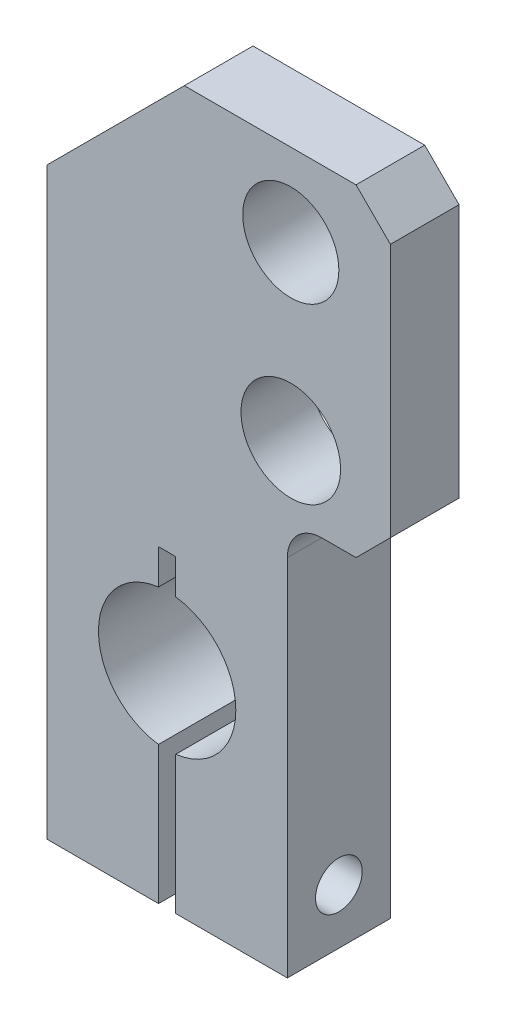
ISO-10303-21;
HEADER;
FILE_DESCRIPTION(('STEP AP214'),'2;1');
FILE_NAME('part.step','',(''),(''),'','','');
FILE_SCHEMA(('AUTOMOTIVE_DESIGN { 1 0 10303 214 1 1 1 1 }'));
ENDSEC;
DATA;
#1=APPLICATION_CONTEXT('core data for automotive mechanical design processes');
#2=APPLICATION_PROTOCOL_DEFINITION('international standard','automotive_design',2000,#1);
#3=PRODUCT_CONTEXT('',#1,'mechanical');
#4=PRODUCT('Part','Part','',(#3));
#5=PRODUCT_RELATED_PRODUCT_CATEGORY('part','',(#4));
#6=PRODUCT_DEFINITION_FORMATION('','',#4);
#7=PRODUCT_DEFINITION_CONTEXT('part definition',#1,'design');
#8=PRODUCT_DEFINITION('design','',#6,#7);
#9=PRODUCT_DEFINITION_SHAPE('','',#8);
#10=(LENGTH_UNIT() NAMED_UNIT(*) SI_UNIT(.MILLI.,.METRE.));
#11=(NAMED_UNIT(*) PLANE_ANGLE_UNIT() SI_UNIT($,.RADIAN.));
#12=(NAMED_UNIT(*) SI_UNIT($,.STERADIAN.) SOLID_ANGLE_UNIT());
#13=UNCERTAINTY_MEASURE_WITH_UNIT(LENGTH_MEASURE(1.E-05),#10,'distance_accuracy_value','');
#14=(GEOMETRIC_REPRESENTATION_CONTEXT(3) GLOBAL_UNCERTAINTY_ASSIGNED_CONTEXT((#13)) GLOBAL_UNIT_ASSIGNED_CONTEXT((#10,
#11,#12)) REPRESENTATION_CONTEXT('',''));
#15=CARTESIAN_POINT('',(0.,0.,0.));
#16=DIRECTION('',(0.,0.,1.));
#17=DIRECTION('',(1.,0.,0.));
#18=AXIS2_PLACEMENT_3D('',#15,#16,#17);
#19=CARTESIAN_POINT('',(-17.5,105.,7.5));
#20=DIRECTION('',(0.,-1.,0.));
#21=DIRECTION('',(0.,0.,-1.));
#22=AXIS2_PLACEMENT_3D('',#19,#20,#21);
#23=PLANE('',#22);
#24=DIRECTION('',(1.,0.,0.));
#25=VECTOR('',#24,1.);
#26=CARTESIAN_POINT('',(32.5,105.,-2.5));
#27=LINE('',#26,#25);
#28=CARTESIAN_POINT('',(2.50000000000008,105.,-2.5));
#29=VERTEX_POINT('',#28);
#30=CARTESIAN_POINT('',(27.5,105.,-2.5));
#31=VERTEX_POINT('',#30);
#32=EDGE_CURVE('E215',#29,#31,#27,.T.);
#33=ORIENTED_EDGE('',*,*,#32,.F.);
#34=DIRECTION('',(0.,0.,1.));
#35=VECTOR('',#34,1.);
#36=CARTESIAN_POINT('',(2.50000000000008,105.,7.5));
#37=LINE('',#36,#35);
#38=CARTESIAN_POINT('',(2.50000000000008,105.,7.5));
#39=VERTEX_POINT('',#38);
#40=EDGE_CURVE('E70',#29,#39,#37,.T.);
#41=ORIENTED_EDGE('',*,*,#40,.T.);
#42=DIRECTION('',(-1.,0.,0.));
#43=VECTOR('',#42,1.);
#44=CARTESIAN_POINT('',(-17.5,105.,7.5));
#45=LINE('',#44,#43);
#46=CARTESIAN_POINT('',(27.5,105.,7.5));
#47=VERTEX_POINT('',#46);
#48=EDGE_CURVE('E283',#47,#39,#45,.T.);
#49=ORIENTED_EDGE('',*,*,#48,.F.);
#50=DIRECTION('',(0.,0.,-1.));
#51=VECTOR('',#50,1.);
#52=CARTESIAN_POINT('',(27.5,105.,7.5));
#53=LINE('',#52,#51);
#54=EDGE_CURVE('E357',#47,#31,#53,.T.);
#55=ORIENTED_EDGE('',*,*,#54,.T.);
#56=EDGE_LOOP('',(#33,#41,#49,#55));
#57=FACE_BOUND('',#56,.T.);
#58=ADVANCED_FACE('F62',(#57),#23,.F.);
#59=CARTESIAN_POINT('',(32.5,58.,7.5));
#60=DIRECTION('',(0.,1.,0.));
#61=DIRECTION('',(0.,0.,1.));
#62=AXIS2_PLACEMENT_3D('',#59,#60,#61);
#63=PLANE('',#62);
#64=DIRECTION('',(-1.,0.,0.));
#65=VECTOR('',#64,1.);
#66=CARTESIAN_POINT('',(32.5,58.,-2.5));
#67=LINE('',#66,#65);
#68=CARTESIAN_POINT('',(27.5,58.,-2.5));
#69=VERTEX_POINT('',#68);
#70=CARTESIAN_POINT('',(22.5,58.,-2.5));
#71=VERTEX_POINT('',#70);
#72=EDGE_CURVE('E230',#69,#71,#67,.T.);
#73=ORIENTED_EDGE('',*,*,#72,.F.);
#74=DIRECTION('',(0.,0.,1.));
#75=VECTOR('',#74,1.);
#76=CARTESIAN_POINT('',(27.5,58.,7.5));
#77=LINE('',#76,#75);
#78=CARTESIAN_POINT('',(27.5,58.,7.5));
#79=VERTEX_POINT('',#78);
#80=EDGE_CURVE('E351',#69,#79,#77,.T.);
#81=ORIENTED_EDGE('',*,*,#80,.T.);
#82=DIRECTION('',(1.,0.,0.));
#83=VECTOR('',#82,1.);
#84=CARTESIAN_POINT('',(32.5,58.,7.5));
#85=LINE('',#84,#83);
#86=CARTESIAN_POINT('',(22.5,58.,7.5));
#87=VERTEX_POINT('',#86);
#88=EDGE_CURVE('E295',#87,#79,#85,.T.);
#89=ORIENTED_EDGE('',*,*,#88,.F.);
#90=DIRECTION('',(0.,0.,-1.));
#91=VECTOR('',#90,1.);
#92=CARTESIAN_POINT('',(22.5,58.,-7.5));
#93=LINE('',#92,#91);
#94=EDGE_CURVE('E327',#87,#71,#93,.T.);
#95=ORIENTED_EDGE('',*,*,#94,.T.);
#96=EDGE_LOOP('',(#73,#81,#89,#95));
#97=FACE_BOUND('',#96,.T.);
#98=ADVANCED_FACE('F405',(#97),#63,.F.);
#99=CARTESIAN_POINT('',(32.5,105.,7.5));
#100=DIRECTION('',(-1.,0.,0.));
#101=DIRECTION('',(0.,-1.,0.));
#102=AXIS2_PLACEMENT_3D('',#99,#100,#101);
#103=PLANE('',#102);
#104=DIRECTION('',(0.,1.,0.));
#105=VECTOR('',#104,1.);
#106=CARTESIAN_POINT('',(32.5,105.,7.5));
#107=LINE('',#106,#105);
#108=CARTESIAN_POINT('',(32.5,63.,7.5));
#109=VERTEX_POINT('',#108);
#110=CARTESIAN_POINT('',(32.5,100.,7.5));
#111=VERTEX_POINT('',#110);
#112=EDGE_CURVE('E298',#109,#111,#107,.T.);
#113=ORIENTED_EDGE('',*,*,#112,.F.);
#114=DIRECTION('',(0.,0.,-1.));
#115=VECTOR('',#114,1.);
#116=CARTESIAN_POINT('',(32.5,63.,7.5));
#117=LINE('',#116,#115);
#118=CARTESIAN_POINT('',(32.5,62.9999999999999,-2.5));
#119=VERTEX_POINT('',#118);
#120=EDGE_CURVE('E344',#109,#119,#117,.T.);
#121=ORIENTED_EDGE('',*,*,#120,.T.);
#122=DIRECTION('',(0.,-1.,0.));
#123=VECTOR('',#122,1.);
#124=CARTESIAN_POINT('',(32.5,105.,-2.5));
#125=LINE('',#124,#123);
#126=CARTESIAN_POINT('',(32.5,100.,-2.5));
#127=VERTEX_POINT('',#126);
#128=EDGE_CURVE('E205',#127,#119,#125,.T.);
#129=ORIENTED_EDGE('',*,*,#128,.F.);
#130=DIRECTION('',(0.,0.,1.));
#131=VECTOR('',#130,1.);
#132=CARTESIAN_POINT('',(32.5,100.,7.5));
#133=LINE('',#132,#131);
#134=EDGE_CURVE('E342',#127,#111,#133,.T.);
#135=ORIENTED_EDGE('',*,*,#134,.T.);
#136=EDGE_LOOP('',(#113,#121,#129,#135));
#137=FACE_BOUND('',#136,.T.);
#138=ADVANCED_FACE('F371',(#137),#103,.F.);
#139=CARTESIAN_POINT('',(18.,93.,-7.5));
#140=DIRECTION('',(0.,0.,1.));
#141=DIRECTION('',(1.,0.,0.));
#142=AXIS2_PLACEMENT_3D('',#139,#140,#141);
#143=CYLINDRICAL_SURFACE('',#142,7.);
#144=CARTESIAN_POINT('',(18.,93.,7.5));
#145=DIRECTION('',(0.,0.,1.));
#146=DIRECTION('',(1.,0.,0.));
#147=AXIS2_PLACEMENT_3D('',#144,#145,#146);
#148=CIRCLE('',#147,7.);
#149=CARTESIAN_POINT('',(25.,93.,7.5));
#150=VERTEX_POINT('',#149);
#151=EDGE_CURVE('E232',#150,#150,#148,.T.);
#152=ORIENTED_EDGE('',*,*,#151,.T.);
#153=EDGE_LOOP('',(#152));
#154=FACE_BOUND('',#153,.T.);
#155=CARTESIAN_POINT('',(18.,93.,-2.5));
#156=DIRECTION('',(0.,0.,-1.));
#157=DIRECTION('',(-1.,0.,0.));
#158=AXIS2_PLACEMENT_3D('',#155,#156,#157);
#159=CIRCLE('',#158,7.);
#160=CARTESIAN_POINT('',(11.,93.,-2.5));
#161=VERTEX_POINT('',#160);
#162=EDGE_CURVE('E214',#161,#161,#159,.F.);
#163=ORIENTED_EDGE('',*,*,#162,.F.);
#164=EDGE_LOOP('',(#163));
#165=FACE_BOUND('',#164,.T.);
#166=ADVANCED_FACE('F395',(#154,#165),#143,.F.);
#167=CARTESIAN_POINT('',(-17.5,105.,7.5));
#168=DIRECTION('',(1.,0.,0.));
#169=DIRECTION('',(0.,1.,0.));
#170=AXIS2_PLACEMENT_3D('',#167,#168,#169);
#171=PLANE('',#170);
#172=DIRECTION('',(0.,-1.,0.));
#173=VECTOR('',#172,1.);
#174=CARTESIAN_POINT('',(-17.5,105.,7.5));
#175=LINE('',#174,#173);
#176=CARTESIAN_POINT('',(-17.5,85.,7.5));
#177=VERTEX_POINT('',#176);
#178=CARTESIAN_POINT('',(-17.5,0.,7.5));
#179=VERTEX_POINT('',#178);
#180=EDGE_CURVE('E285',#177,#179,#175,.T.);
#181=ORIENTED_EDGE('',*,*,#180,.F.);
#182=DIRECTION('',(0.,0.,-1.));
#183=VECTOR('',#182,1.);
#184=CARTESIAN_POINT('',(-17.5,85.,7.5));
#185=LINE('',#184,#183);
#186=CARTESIAN_POINT('',(-17.5,85.,-2.5));
#187=VERTEX_POINT('',#186);
#188=EDGE_CURVE('E222',#177,#187,#185,.T.);
#189=ORIENTED_EDGE('',*,*,#188,.T.);
#190=DIRECTION('',(0.,1.,0.));
#191=VECTOR('',#190,1.);
#192=CARTESIAN_POINT('',(-17.5,105.,-2.5));
#193=LINE('',#192,#191);
#194=CARTESIAN_POINT('',(-17.5,55.,-2.5));
#195=VERTEX_POINT('',#194);
#196=EDGE_CURVE('E200',#195,#187,#193,.T.);
#197=ORIENTED_EDGE('',*,*,#196,.F.);
#198=DIRECTION('',(0.,0.,-1.));
#199=VECTOR('',#198,1.);
#200=CARTESIAN_POINT('',(-17.5,55.,-2.5));
#201=LINE('',#200,#199);
#202=CARTESIAN_POINT('',(-17.5,55.,-7.5));
#203=VERTEX_POINT('',#202);
#204=EDGE_CURVE('E208',#195,#203,#201,.T.);
#205=ORIENTED_EDGE('',*,*,#204,.T.);
#206=DIRECTION('',(0.,-1.,0.));
#207=VECTOR('',#206,1.);
#208=CARTESIAN_POINT('',(-17.5,105.,-7.5));
#209=LINE('',#208,#207);
#210=CARTESIAN_POINT('',(-17.5,0.,-7.5));
#211=VERTEX_POINT('',#210);
#212=EDGE_CURVE('E302',#203,#211,#209,.T.);
#213=ORIENTED_EDGE('',*,*,#212,.T.);
#214=DIRECTION('',(0.,0.,-1.));
#215=VECTOR('',#214,1.);
#216=CARTESIAN_POINT('',(-17.5,0.,7.5));
#217=LINE('',#216,#215);
#218=EDGE_CURVE('E312',#179,#211,#217,.T.);
#219=ORIENTED_EDGE('',*,*,#218,.F.);
#220=EDGE_LOOP('',(#181,#189,#197,#205,#213,#219));
#221=FACE_BOUND('',#220,.T.);
#222=CARTESIAN_POINT('',(-17.5,8.,0.));
#223=DIRECTION('',(1.,0.,0.));
#224=DIRECTION('',(0.,1.,0.));
#225=AXIS2_PLACEMENT_3D('',#222,#223,#224);
#226=CIRCLE('',#225,4.25);
#227=CARTESIAN_POINT('',(-17.5,12.25,0.));
#228=VERTEX_POINT('',#227);
#229=EDGE_CURVE('E239',#228,#228,#226,.T.);
#230=ORIENTED_EDGE('',*,*,#229,.T.);
#231=EDGE_LOOP('',(#230));
#232=FACE_BOUND('',#231,.T.);
#233=ADVANCED_FACE('F219',(#221,#232),#171,.F.);
#234=CARTESIAN_POINT('',(-1.25000000000001,45.,-7.5));
#235=DIRECTION('',(-1.,0.,0.));
#236=DIRECTION('',(0.,-1.,0.));
#237=AXIS2_PLACEMENT_3D('',#234,#235,#236);
#238=PLANE('',#237);
#239=DIRECTION('',(0.,-1.,0.));
#240=VECTOR('',#239,1.);
#241=CARTESIAN_POINT('',(-1.25000000000001,45.,7.5));
#242=LINE('',#241,#240);
#243=CARTESIAN_POINT('',(-1.25,20.0784325835078,7.5));
#244=VERTEX_POINT('',#243);
#245=CARTESIAN_POINT('',(-1.25,0.,7.5));
#246=VERTEX_POINT('',#245);
#247=EDGE_CURVE('E245',#244,#246,#242,.T.);
#248=ORIENTED_EDGE('',*,*,#247,.T.);
#249=DIRECTION('',(0.,0.,1.));
#250=VECTOR('',#249,1.);
#251=CARTESIAN_POINT('',(-1.25,0.,-7.5));
#252=LINE('',#251,#250);
#253=CARTESIAN_POINT('',(-1.25,0.,-7.5));
#254=VERTEX_POINT('',#253);
#255=EDGE_CURVE('E257',#254,#246,#252,.T.);
#256=ORIENTED_EDGE('',*,*,#255,.F.);
#257=DIRECTION('',(0.,-1.,0.));
#258=VECTOR('',#257,1.);
#259=CARTESIAN_POINT('',(-1.25000000000001,45.,-7.5));
#260=LINE('',#259,#258);
#261=CARTESIAN_POINT('',(-1.25,20.0784325835078,-7.5));
#262=VERTEX_POINT('',#261);
#263=EDGE_CURVE('E250',#262,#254,#260,.T.);
#264=ORIENTED_EDGE('',*,*,#263,.F.);
#265=DIRECTION('',(0.,0.,1.));
#266=VECTOR('',#265,1.);
#267=CARTESIAN_POINT('',(-1.25,20.0784325835078,-7.5));
#268=LINE('',#267,#266);
#269=EDGE_CURVE('E324',#244,#262,#268,.F.);
#270=ORIENTED_EDGE('',*,*,#269,.F.);
#271=EDGE_LOOP('',(#248,#256,#264,#270));
#272=FACE_BOUND('',#271,.T.);
#273=CARTESIAN_POINT('',(-1.25,8.,0.));
#274=DIRECTION('',(-1.,0.,0.));
#275=DIRECTION('',(0.,-1.,0.));
#276=AXIS2_PLACEMENT_3D('',#273,#274,#275);
#277=CIRCLE('',#276,4.25);
#278=CARTESIAN_POINT('',(-1.25,3.75,0.));
#279=VERTEX_POINT('',#278);
#280=EDGE_CURVE('E242',#279,#279,#277,.T.);
#281=ORIENTED_EDGE('',*,*,#280,.T.);
#282=EDGE_LOOP('',(#281));
#283=FACE_BOUND('',#282,.T.);
#284=ADVANCED_FACE('F403',(#272,#283),#238,.F.);
#285=CARTESIAN_POINT('',(-17.5,0.,7.5));
#286=DIRECTION('',(0.,1.,0.));
#287=DIRECTION('',(0.,0.,1.));
#288=AXIS2_PLACEMENT_3D('',#285,#286,#287);
#289=PLANE('',#288);
#290=DIRECTION('',(1.,0.,0.));
#291=VECTOR('',#290,1.);
#292=CARTESIAN_POINT('',(-17.5,0.,-7.5));
#293=LINE('',#292,#291);
#294=EDGE_CURVE('E305',#211,#254,#293,.T.);
#295=ORIENTED_EDGE('',*,*,#294,.T.);
#296=ORIENTED_EDGE('',*,*,#255,.T.);
#297=DIRECTION('',(1.,0.,0.));
#298=VECTOR('',#297,1.);
#299=CARTESIAN_POINT('',(-17.5,0.,7.5));
#300=LINE('',#299,#298);
#301=EDGE_CURVE('E289',#179,#246,#300,.T.);
#302=ORIENTED_EDGE('',*,*,#301,.F.);
#303=ORIENTED_EDGE('',*,*,#218,.T.);
#304=EDGE_LOOP('',(#295,#296,#302,#303));
#305=FACE_BOUND('',#304,.T.);
#306=ADVANCED_FACE('F439',(#305),#289,.F.);
#307=CARTESIAN_POINT('',(0.,30.,-7.5));
#308=DIRECTION('',(0.,0.,1.));
#309=DIRECTION('',(1.,0.,0.));
#310=AXIS2_PLACEMENT_3D('',#307,#308,#309);
#311=CYLINDRICAL_SURFACE('',#310,10.);
#312=CARTESIAN_POINT('',(0.,30.,7.5));
#313=DIRECTION('',(0.,0.,1.));
#314=DIRECTION('',(1.,0.,0.));
#315=AXIS2_PLACEMENT_3D('',#312,#313,#314);
#316=CIRCLE('',#315,10.);
#317=CARTESIAN_POINT('',(-1.25,39.9215674164922,7.5));
#318=VERTEX_POINT('',#317);
#319=EDGE_CURVE('E280',#318,#244,#316,.T.);
#320=ORIENTED_EDGE('',*,*,#319,.T.);
#321=ORIENTED_EDGE('',*,*,#269,.T.);
#322=CARTESIAN_POINT('',(0.,30.,-7.5));
#323=DIRECTION('',(0.,0.,1.));
#324=DIRECTION('',(1.,0.,0.));
#325=AXIS2_PLACEMENT_3D('',#322,#323,#324);
#326=CIRCLE('',#325,10.);
#327=CARTESIAN_POINT('',(-1.25,39.9215674164922,-7.5));
#328=VERTEX_POINT('',#327);
#329=EDGE_CURVE('E279',#328,#262,#326,.T.);
#330=ORIENTED_EDGE('',*,*,#329,.F.);
#331=DIRECTION('',(0.,0.,1.));
#332=VECTOR('',#331,1.);
#333=CARTESIAN_POINT('',(-1.25,39.9215674164922,-7.5));
#334=LINE('',#333,#332);
#335=EDGE_CURVE('E321',#328,#318,#334,.T.);
#336=ORIENTED_EDGE('',*,*,#335,.T.);
#337=EDGE_LOOP('',(#320,#321,#330,#336));
#338=FACE_BOUND('',#337,.T.);
#339=ADVANCED_FACE('F446',(#338),#311,.F.);
#340=CARTESIAN_POINT('',(1.25,0.,7.5));
#341=VERTEX_POINT('',#340);
#342=CARTESIAN_POINT('',(17.5,0.,7.5));
#343=VERTEX_POINT('',#342);
#344=EDGE_CURVE('E288',#341,#343,#300,.T.);
#345=ORIENTED_EDGE('',*,*,#344,.F.);
#346=DIRECTION('',(0.,0.,1.));
#347=VECTOR('',#346,1.);
#348=CARTESIAN_POINT('',(1.25,0.,-7.5));
#349=LINE('',#348,#347);
#350=CARTESIAN_POINT('',(1.25,0.,-7.5));
#351=VERTEX_POINT('',#350);
#352=EDGE_CURVE('E272',#351,#341,#349,.T.);
#353=ORIENTED_EDGE('',*,*,#352,.F.);
#354=CARTESIAN_POINT('',(17.5,0.,-7.5));
#355=VERTEX_POINT('',#354);
#356=EDGE_CURVE('E304',#351,#355,#293,.T.);
#357=ORIENTED_EDGE('',*,*,#356,.T.);
#358=DIRECTION('',(0.,0.,-1.));
#359=VECTOR('',#358,1.);
#360=CARTESIAN_POINT('',(17.5,0.,7.5));
#361=LINE('',#360,#359);
#362=EDGE_CURVE('E301',#343,#355,#361,.T.);
#363=ORIENTED_EDGE('',*,*,#362,.F.);
#364=EDGE_LOOP('',(#345,#353,#357,#363));
#365=FACE_BOUND('',#364,.T.);
#366=ADVANCED_FACE('F474',(#365),#289,.F.);
#367=CARTESIAN_POINT('',(17.5,58.,7.5));
#368=DIRECTION('',(-1.,0.,0.));
#369=DIRECTION('',(0.,-1.,0.));
#370=AXIS2_PLACEMENT_3D('',#367,#368,#369);
#371=PLANE('',#370);
#372=CARTESIAN_POINT('',(17.5,8.,0.));
#373=DIRECTION('',(1.,0.,0.));
#374=DIRECTION('',(0.,0.,-1.));
#375=AXIS2_PLACEMENT_3D('',#372,#373,#374);
#376=CIRCLE('',#375,3.39999999999999);
#377=CARTESIAN_POINT('',(17.5,8.,-3.39999999999999));
#378=VERTEX_POINT('',#377);
#379=EDGE_CURVE('E235',#378,#378,#376,.T.);
#380=ORIENTED_EDGE('',*,*,#379,.F.);
#381=EDGE_LOOP('',(#380));
#382=FACE_BOUND('',#381,.T.);
#383=DIRECTION('',(0.,1.,0.));
#384=VECTOR('',#383,1.);
#385=CARTESIAN_POINT('',(17.5,58.,-7.5));
#386=LINE('',#385,#384);
#387=CARTESIAN_POINT('',(17.5,53.,-7.5));
#388=VERTEX_POINT('',#387);
#389=EDGE_CURVE('E286',#355,#388,#386,.T.);
#390=ORIENTED_EDGE('',*,*,#389,.T.);
#391=DIRECTION('',(0.,0.,-1.));
#392=VECTOR('',#391,1.);
#393=CARTESIAN_POINT('',(17.5,53.,7.5));
#394=LINE('',#393,#392);
#395=CARTESIAN_POINT('',(17.5,53.,7.5));
#396=VERTEX_POINT('',#395);
#397=EDGE_CURVE('E330',#388,#396,#394,.F.);
#398=ORIENTED_EDGE('',*,*,#397,.T.);
#399=DIRECTION('',(0.,1.,0.));
#400=VECTOR('',#399,1.);
#401=CARTESIAN_POINT('',(17.5,58.,7.5));
#402=LINE('',#401,#400);
#403=EDGE_CURVE('E292',#343,#396,#402,.T.);
#404=ORIENTED_EDGE('',*,*,#403,.F.);
#405=ORIENTED_EDGE('',*,*,#362,.T.);
#406=EDGE_LOOP('',(#390,#398,#404,#405));
#407=FACE_BOUND('',#406,.T.);
#408=ADVANCED_FACE('F477',(#382,#407),#371,.F.);
#409=CARTESIAN_POINT('',(32.5,105.,7.5));
#410=DIRECTION('',(0.,0.,-1.));
#411=DIRECTION('',(-1.,0.,0.));
#412=AXIS2_PLACEMENT_3D('',#409,#410,#411);
#413=PLANE('',#412);
#414=CARTESIAN_POINT('',(18.,68.,7.5));
#415=DIRECTION('',(0.,0.,-1.));
#416=DIRECTION('',(-1.,0.,0.));
#417=AXIS2_PLACEMENT_3D('',#414,#415,#416);
#418=CIRCLE('',#417,7.25);
#419=CARTESIAN_POINT('',(10.75,68.,7.5));
#420=VERTEX_POINT('',#419);
#421=EDGE_CURVE('E227',#420,#420,#418,.T.);
#422=ORIENTED_EDGE('',*,*,#421,.T.);
#423=EDGE_LOOP('',(#422));
#424=FACE_BOUND('',#423,.T.);
#425=ORIENTED_EDGE('',*,*,#151,.F.);
#426=EDGE_LOOP('',(#425));
#427=FACE_BOUND('',#426,.T.);
#428=ORIENTED_EDGE('',*,*,#48,.T.);
#429=DIRECTION('',(0.707106781186549,0.707106781186546,0.));
#430=VECTOR('',#429,1.);
#431=CARTESIAN_POINT('',(-17.5,85.,7.5));
#432=LINE('',#431,#430);
#433=EDGE_CURVE('E12',#39,#177,#432,.F.);
#434=ORIENTED_EDGE('',*,*,#433,.T.);
#435=ORIENTED_EDGE('',*,*,#180,.T.);
#436=ORIENTED_EDGE('',*,*,#301,.T.);
#437=ORIENTED_EDGE('',*,*,#247,.F.);
#438=ORIENTED_EDGE('',*,*,#319,.F.);
#439=CARTESIAN_POINT('',(-1.25000000000001,45.,7.5));
#440=VERTEX_POINT('',#439);
#441=EDGE_CURVE('E258',#440,#318,#242,.T.);
#442=ORIENTED_EDGE('',*,*,#441,.F.);
#443=DIRECTION('',(-1.,0.,0.));
#444=VECTOR('',#443,1.);
#445=CARTESIAN_POINT('',(-1.25000000000001,45.,7.5));
#446=LINE('',#445,#444);
#447=CARTESIAN_POINT('',(1.25000000000001,45.,7.5));
#448=VERTEX_POINT('',#447);
#449=EDGE_CURVE('E263',#448,#440,#446,.T.);
#450=ORIENTED_EDGE('',*,*,#449,.F.);
#451=DIRECTION('',(0.,1.,0.));
#452=VECTOR('',#451,1.);
#453=CARTESIAN_POINT('',(1.25000000000001,45.,7.5));
#454=LINE('',#453,#452);
#455=CARTESIAN_POINT('',(1.25,39.9215674164922,7.5));
#456=VERTEX_POINT('',#455);
#457=EDGE_CURVE('E260',#456,#448,#454,.T.);
#458=ORIENTED_EDGE('',*,*,#457,.F.);
#459=CARTESIAN_POINT('',(1.25,20.0784325835078,7.5));
#460=VERTEX_POINT('',#459);
#461=EDGE_CURVE('E268',#460,#456,#316,.T.);
#462=ORIENTED_EDGE('',*,*,#461,.F.);
#463=EDGE_CURVE('E261',#341,#460,#454,.T.);
#464=ORIENTED_EDGE('',*,*,#463,.F.);
#465=ORIENTED_EDGE('',*,*,#344,.T.);
#466=ORIENTED_EDGE('',*,*,#403,.T.);
#467=CARTESIAN_POINT('',(22.5,53.,7.5));
#468=DIRECTION('',(0.,0.,-1.));
#469=DIRECTION('',(-1.,0.,0.));
#470=AXIS2_PLACEMENT_3D('',#467,#468,#469);
#471=CIRCLE('',#470,5.);
#472=EDGE_CURVE('E334',#396,#87,#471,.T.);
#473=ORIENTED_EDGE('',*,*,#472,.T.);
#474=ORIENTED_EDGE('',*,*,#88,.T.);
#475=DIRECTION('',(-0.70710678118655,-0.707106781186545,0.));
#476=VECTOR('',#475,1.);
#477=CARTESIAN_POINT('',(32.5,63.,7.5));
#478=LINE('',#477,#476);
#479=EDGE_CURVE('E355',#79,#109,#478,.F.);
#480=ORIENTED_EDGE('',*,*,#479,.T.);
#481=ORIENTED_EDGE('',*,*,#112,.T.);
#482=DIRECTION('',(0.707106781186547,-0.707106781186549,0.));
#483=VECTOR('',#482,1.);
#484=CARTESIAN_POINT('',(27.5,105.,7.5));
#485=LINE('',#484,#483);
#486=EDGE_CURVE('E353',#111,#47,#485,.F.);
#487=ORIENTED_EDGE('',*,*,#486,.T.);
#488=EDGE_LOOP('',(#428,#434,#435,#436,#437,#438,#442,#450,#458,#462,#464,#465,#466,#473,#474,
#480,#481,#487));
#489=FACE_BOUND('',#488,.T.);
#490=ADVANCED_FACE('F380',(#424,#427,#489),#413,.F.);
#491=CARTESIAN_POINT('',(32.5,105.,-7.5));
#492=DIRECTION('',(0.,0.,-1.));
#493=DIRECTION('',(-1.,0.,0.));
#494=AXIS2_PLACEMENT_3D('',#491,#492,#493);
#495=PLANE('',#494);
#496=DIRECTION('',(-1.,0.,0.));
#497=VECTOR('',#496,1.);
#498=CARTESIAN_POINT('',(32.5,55.,-7.5));
#499=LINE('',#498,#497);
#500=CARTESIAN_POINT('',(17.9174243050442,55.,-7.5));
#501=VERTEX_POINT('',#500);
#502=EDGE_CURVE('E211',#501,#203,#499,.T.);
#503=ORIENTED_EDGE('',*,*,#502,.F.);
#504=CARTESIAN_POINT('',(22.5,53.,-7.5));
#505=DIRECTION('',(0.,0.,-1.));
#506=DIRECTION('',(-1.,0.,0.));
#507=AXIS2_PLACEMENT_3D('',#504,#505,#506);
#508=CIRCLE('',#507,5.);
#509=EDGE_CURVE('E332',#501,#388,#508,.F.);
#510=ORIENTED_EDGE('',*,*,#509,.T.);
#511=ORIENTED_EDGE('',*,*,#389,.F.);
#512=ORIENTED_EDGE('',*,*,#356,.F.);
#513=DIRECTION('',(0.,1.,0.));
#514=VECTOR('',#513,1.);
#515=CARTESIAN_POINT('',(1.25000000000001,45.,-7.5));
#516=LINE('',#515,#514);
#517=CARTESIAN_POINT('',(1.25,20.0784325835078,-7.5));
#518=VERTEX_POINT('',#517);
#519=EDGE_CURVE('E251',#351,#518,#516,.T.);
#520=ORIENTED_EDGE('',*,*,#519,.T.);
#521=CARTESIAN_POINT('',(1.25000000000001,39.9215674164922,-7.5));
#522=VERTEX_POINT('',#521);
#523=EDGE_CURVE('E276',#518,#522,#326,.T.);
#524=ORIENTED_EDGE('',*,*,#523,.T.);
#525=CARTESIAN_POINT('',(1.25000000000001,45.,-7.5));
#526=VERTEX_POINT('',#525);
#527=EDGE_CURVE('E249',#522,#526,#516,.T.);
#528=ORIENTED_EDGE('',*,*,#527,.T.);
#529=DIRECTION('',(-1.,0.,0.));
#530=VECTOR('',#529,1.);
#531=CARTESIAN_POINT('',(-1.25000000000001,45.,-7.5));
#532=LINE('',#531,#530);
#533=CARTESIAN_POINT('',(-1.25000000000001,45.,-7.5));
#534=VERTEX_POINT('',#533);
#535=EDGE_CURVE('E254',#526,#534,#532,.T.);
#536=ORIENTED_EDGE('',*,*,#535,.T.);
#537=EDGE_CURVE('E246',#534,#328,#260,.T.);
#538=ORIENTED_EDGE('',*,*,#537,.T.);
#539=ORIENTED_EDGE('',*,*,#329,.T.);
#540=ORIENTED_EDGE('',*,*,#263,.T.);
#541=ORIENTED_EDGE('',*,*,#294,.F.);
#542=ORIENTED_EDGE('',*,*,#212,.F.);
#543=EDGE_LOOP('',(#503,#510,#511,#512,#520,#524,#528,#536,#538,#539,#540,#541,#542));
#544=FACE_BOUND('',#543,.T.);
#545=ADVANCED_FACE('F453',(#544),#495,.T.);
#546=ORIENTED_EDGE('',*,*,#461,.T.);
#547=DIRECTION('',(0.,0.,1.));
#548=VECTOR('',#547,1.);
#549=CARTESIAN_POINT('',(1.25,39.9215674164922,-7.5));
#550=LINE('',#549,#548);
#551=EDGE_CURVE('E318',#456,#522,#550,.F.);
#552=ORIENTED_EDGE('',*,*,#551,.T.);
#553=ORIENTED_EDGE('',*,*,#523,.F.);
#554=DIRECTION('',(0.,0.,1.));
#555=VECTOR('',#554,1.);
#556=CARTESIAN_POINT('',(1.25,20.0784325835078,-7.5));
#557=LINE('',#556,#555);
#558=EDGE_CURVE('E315',#518,#460,#557,.T.);
#559=ORIENTED_EDGE('',*,*,#558,.T.);
#560=EDGE_LOOP('',(#546,#552,#553,#559));
#561=FACE_BOUND('',#560,.T.);
#562=ADVANCED_FACE('F464',(#561),#311,.F.);
#563=CARTESIAN_POINT('',(1.25000000000001,45.,-7.5));
#564=DIRECTION('',(1.,0.,0.));
#565=DIRECTION('',(0.,1.,0.));
#566=AXIS2_PLACEMENT_3D('',#563,#564,#565);
#567=PLANE('',#566);
#568=CARTESIAN_POINT('',(1.25,8.,0.));
#569=DIRECTION('',(1.,0.,0.));
#570=DIRECTION('',(0.,1.,0.));
#571=AXIS2_PLACEMENT_3D('',#568,#569,#570);
#572=CIRCLE('',#571,3.39999999999999);
#573=CARTESIAN_POINT('',(1.25,11.4,0.));
#574=VERTEX_POINT('',#573);
#575=EDGE_CURVE('E238',#574,#574,#572,.T.);
#576=ORIENTED_EDGE('',*,*,#575,.T.);
#577=EDGE_LOOP('',(#576));
#578=FACE_BOUND('',#577,.T.);
#579=ORIENTED_EDGE('',*,*,#519,.F.);
#580=ORIENTED_EDGE('',*,*,#352,.T.);
#581=ORIENTED_EDGE('',*,*,#463,.T.);
#582=ORIENTED_EDGE('',*,*,#558,.F.);
#583=EDGE_LOOP('',(#579,#580,#581,#582));
#584=FACE_BOUND('',#583,.T.);
#585=ADVANCED_FACE('F467',(#578,#584),#567,.F.);
#586=ORIENTED_EDGE('',*,*,#537,.F.);
#587=DIRECTION('',(0.,0.,1.));
#588=VECTOR('',#587,1.);
#589=CARTESIAN_POINT('',(-1.25000000000001,45.,-7.5));
#590=LINE('',#589,#588);
#591=EDGE_CURVE('E266',#534,#440,#590,.T.);
#592=ORIENTED_EDGE('',*,*,#591,.T.);
#593=ORIENTED_EDGE('',*,*,#441,.T.);
#594=ORIENTED_EDGE('',*,*,#335,.F.);
#595=EDGE_LOOP('',(#586,#592,#593,#594));
#596=FACE_BOUND('',#595,.T.);
#597=ADVANCED_FACE('F451',(#596),#238,.F.);
#598=ORIENTED_EDGE('',*,*,#457,.T.);
#599=DIRECTION('',(0.,0.,1.));
#600=VECTOR('',#599,1.);
#601=CARTESIAN_POINT('',(1.25000000000001,45.,-7.5));
#602=LINE('',#601,#600);
#603=EDGE_CURVE('E269',#526,#448,#602,.T.);
#604=ORIENTED_EDGE('',*,*,#603,.F.);
#605=ORIENTED_EDGE('',*,*,#527,.F.);
#606=ORIENTED_EDGE('',*,*,#551,.F.);
#607=EDGE_LOOP('',(#598,#604,#605,#606));
#608=FACE_BOUND('',#607,.T.);
#609=ADVANCED_FACE('F503',(#608),#567,.F.);
#610=CARTESIAN_POINT('',(-1.25000000000001,45.,-7.5));
#611=DIRECTION('',(0.,1.,0.));
#612=DIRECTION('',(0.,0.,1.));
#613=AXIS2_PLACEMENT_3D('',#610,#611,#612);
#614=PLANE('',#613);
#615=ORIENTED_EDGE('',*,*,#449,.T.);
#616=ORIENTED_EDGE('',*,*,#591,.F.);
#617=ORIENTED_EDGE('',*,*,#535,.F.);
#618=ORIENTED_EDGE('',*,*,#603,.T.);
#619=EDGE_LOOP('',(#615,#616,#617,#618));
#620=FACE_BOUND('',#619,.T.);
#621=ADVANCED_FACE('F422',(#620),#614,.F.);
#622=CARTESIAN_POINT('',(22.5,53.,7.5));
#623=DIRECTION('',(0.,0.,1.));
#624=DIRECTION('',(1.,0.,0.));
#625=AXIS2_PLACEMENT_3D('',#622,#623,#624);
#626=CYLINDRICAL_SURFACE('',#625,5.);
#627=ORIENTED_EDGE('',*,*,#509,.F.);
#628=DIRECTION('',(0.,0.,1.));
#629=VECTOR('',#628,1.);
#630=CARTESIAN_POINT('',(17.9174243050442,55.,7.5));
#631=LINE('',#630,#629);
#632=CARTESIAN_POINT('',(17.9174243050442,55.,-2.5));
#633=VERTEX_POINT('',#632);
#634=EDGE_CURVE('E336',#501,#633,#631,.T.);
#635=ORIENTED_EDGE('',*,*,#634,.T.);
#636=CARTESIAN_POINT('',(22.5,53.,-2.5));
#637=DIRECTION('',(0.,0.,-1.));
#638=DIRECTION('',(-1.,0.,0.));
#639=AXIS2_PLACEMENT_3D('',#636,#637,#638);
#640=CIRCLE('',#639,5.);
#641=EDGE_CURVE('E202',#71,#633,#640,.F.);
#642=ORIENTED_EDGE('',*,*,#641,.F.);
#643=ORIENTED_EDGE('',*,*,#94,.F.);
#644=ORIENTED_EDGE('',*,*,#472,.F.);
#645=ORIENTED_EDGE('',*,*,#397,.F.);
#646=EDGE_LOOP('',(#627,#635,#642,#643,#644,#645));
#647=FACE_BOUND('',#646,.T.);
#648=ADVANCED_FACE('F418',(#647),#626,.F.);
#649=CARTESIAN_POINT('',(10.7708152801713,8.,0.));
#650=DIRECTION('',(-1.,0.,0.));
#651=DIRECTION('',(0.,-1.,0.));
#652=AXIS2_PLACEMENT_3D('',#649,#650,#651);
#653=CYLINDRICAL_SURFACE('',#652,4.25);
#654=ORIENTED_EDGE('',*,*,#280,.F.);
#655=EDGE_LOOP('',(#654));
#656=FACE_BOUND('',#655,.T.);
#657=ORIENTED_EDGE('',*,*,#229,.F.);
#658=EDGE_LOOP('',(#657));
#659=FACE_BOUND('',#658,.T.);
#660=ADVANCED_FACE('F421',(#656,#659),#653,.F.);
#661=CARTESIAN_POINT('',(17.5,8.,0.));
#662=DIRECTION('',(1.,0.,0.));
#663=DIRECTION('',(0.,0.,-1.));
#664=AXIS2_PLACEMENT_3D('',#661,#662,#663);
#665=CYLINDRICAL_SURFACE('',#664,3.39999999999999);
#666=ORIENTED_EDGE('',*,*,#379,.T.);
#667=EDGE_LOOP('',(#666));
#668=FACE_BOUND('',#667,.T.);
#669=ORIENTED_EDGE('',*,*,#575,.F.);
#670=EDGE_LOOP('',(#669));
#671=FACE_BOUND('',#670,.T.);
#672=ADVANCED_FACE('F493',(#668,#671),#665,.F.);
#673=CARTESIAN_POINT('',(32.5,55.,-2.5));
#674=DIRECTION('',(0.,-1.,0.));
#675=DIRECTION('',(0.,0.,-1.));
#676=AXIS2_PLACEMENT_3D('',#673,#674,#675);
#677=PLANE('',#676);
#678=ORIENTED_EDGE('',*,*,#502,.T.);
#679=ORIENTED_EDGE('',*,*,#204,.F.);
#680=DIRECTION('',(-1.,0.,0.));
#681=VECTOR('',#680,1.);
#682=CARTESIAN_POINT('',(32.5,55.,-2.5));
#683=LINE('',#682,#681);
#684=EDGE_CURVE('E196',#633,#195,#683,.T.);
#685=ORIENTED_EDGE('',*,*,#684,.F.);
#686=ORIENTED_EDGE('',*,*,#634,.F.);
#687=EDGE_LOOP('',(#678,#679,#685,#686));
#688=FACE_BOUND('',#687,.T.);
#689=ADVANCED_FACE('F209',(#688),#677,.F.);
#690=CARTESIAN_POINT('',(32.5,55.,-2.5));
#691=DIRECTION('',(0.,0.,-1.));
#692=DIRECTION('',(-1.,0.,0.));
#693=AXIS2_PLACEMENT_3D('',#690,#691,#692);
#694=PLANE('',#693);
#695=CARTESIAN_POINT('',(18.,68.,-2.5));
#696=DIRECTION('',(0.,0.,-1.));
#697=DIRECTION('',(-1.,0.,0.));
#698=AXIS2_PLACEMENT_3D('',#695,#696,#697);
#699=CIRCLE('',#698,7.25);
#700=CARTESIAN_POINT('',(10.75,68.,-2.5));
#701=VERTEX_POINT('',#700);
#702=EDGE_CURVE('E374',#701,#701,#699,.T.);
#703=ORIENTED_EDGE('',*,*,#702,.F.);
#704=EDGE_LOOP('',(#703));
#705=FACE_BOUND('',#704,.T.);
#706=ORIENTED_EDGE('',*,*,#162,.T.);
#707=EDGE_LOOP('',(#706));
#708=FACE_BOUND('',#707,.T.);
#709=ORIENTED_EDGE('',*,*,#196,.T.);
#710=DIRECTION('',(-0.707106781186549,-0.707106781186546,0.));
#711=VECTOR('',#710,1.);
#712=CARTESIAN_POINT('',(-7.49999999999992,95.,-2.5));
#713=LINE('',#712,#711);
#714=EDGE_CURVE('E84',#187,#29,#713,.F.);
#715=ORIENTED_EDGE('',*,*,#714,.T.);
#716=ORIENTED_EDGE('',*,*,#32,.T.);
#717=DIRECTION('',(-0.707106781186547,0.707106781186549,0.));
#718=VECTOR('',#717,1.);
#719=CARTESIAN_POINT('',(55.,77.4999999999999,-2.5));
#720=LINE('',#719,#718);
#721=EDGE_CURVE('E347',#31,#127,#720,.F.);
#722=ORIENTED_EDGE('',*,*,#721,.T.);
#723=ORIENTED_EDGE('',*,*,#128,.T.);
#724=DIRECTION('',(0.70710678118655,0.707106781186545,0.));
#725=VECTOR('',#724,1.);
#726=CARTESIAN_POINT('',(28.5,59.,-2.5));
#727=LINE('',#726,#725);
#728=EDGE_CURVE('E349',#119,#69,#727,.F.);
#729=ORIENTED_EDGE('',*,*,#728,.T.);
#730=ORIENTED_EDGE('',*,*,#72,.T.);
#731=ORIENTED_EDGE('',*,*,#641,.T.);
#732=ORIENTED_EDGE('',*,*,#684,.T.);
#733=EDGE_LOOP('',(#709,#715,#716,#722,#723,#729,#730,#731,#732));
#734=FACE_BOUND('',#733,.T.);
#735=ADVANCED_FACE('F198',(#705,#708,#734),#694,.T.);
#736=CARTESIAN_POINT('',(32.5,63.,7.5));
#737=DIRECTION('',(-0.707106781186545,0.70710678118655,0.));
#738=DIRECTION('',(-0.70710678118655,-0.707106781186545,0.));
#739=AXIS2_PLACEMENT_3D('',#736,#737,#738);
#740=PLANE('',#739);
#741=ORIENTED_EDGE('',*,*,#479,.F.);
#742=ORIENTED_EDGE('',*,*,#80,.F.);
#743=ORIENTED_EDGE('',*,*,#728,.F.);
#744=ORIENTED_EDGE('',*,*,#120,.F.);
#745=EDGE_LOOP('',(#741,#742,#743,#744));
#746=FACE_BOUND('',#745,.T.);
#747=ADVANCED_FACE('F391',(#746),#740,.F.);
#748=CARTESIAN_POINT('',(27.5,105.,7.5));
#749=DIRECTION('',(-0.707106781186548,-0.707106781186546,0.));
#750=DIRECTION('',(0.707106781186547,-0.707106781186549,0.));
#751=AXIS2_PLACEMENT_3D('',#748,#749,#750);
#752=PLANE('',#751);
#753=ORIENTED_EDGE('',*,*,#486,.F.);
#754=ORIENTED_EDGE('',*,*,#134,.F.);
#755=ORIENTED_EDGE('',*,*,#721,.F.);
#756=ORIENTED_EDGE('',*,*,#54,.F.);
#757=EDGE_LOOP('',(#753,#754,#755,#756));
#758=FACE_BOUND('',#757,.T.);
#759=ADVANCED_FACE('F365',(#758),#752,.F.);
#760=CARTESIAN_POINT('',(-17.5,85.,7.5));
#761=DIRECTION('',(0.707106781186546,-0.707106781186549,0.));
#762=DIRECTION('',(0.707106781186549,0.707106781186546,0.));
#763=AXIS2_PLACEMENT_3D('',#760,#761,#762);
#764=PLANE('',#763);
#765=ORIENTED_EDGE('',*,*,#433,.F.);
#766=ORIENTED_EDGE('',*,*,#40,.F.);
#767=ORIENTED_EDGE('',*,*,#714,.F.);
#768=ORIENTED_EDGE('',*,*,#188,.F.);
#769=EDGE_LOOP('',(#765,#766,#767,#768));
#770=FACE_BOUND('',#769,.T.);
#771=ADVANCED_FACE('F64',(#770),#764,.F.);
#772=CARTESIAN_POINT('',(18.,68.,7.5));
#773=DIRECTION('',(0.,0.,-1.));
#774=DIRECTION('',(-1.,0.,0.));
#775=AXIS2_PLACEMENT_3D('',#772,#773,#774);
#776=CYLINDRICAL_SURFACE('',#775,7.25);
#777=ORIENTED_EDGE('',*,*,#421,.F.);
#778=EDGE_LOOP('',(#777));
#779=FACE_BOUND('',#778,.T.);
#780=ORIENTED_EDGE('',*,*,#702,.T.);
#781=EDGE_LOOP('',(#780));
#782=FACE_BOUND('',#781,.T.);
#783=ADVANCED_FACE('F383',(#779,#782),#776,.F.);
#784=CLOSED_SHELL('',(#58,#98,#138,#166,#233,#284,#306,#339,#366,#408,#490,#545,#562,#585,#597,
#609,#621,#648,#660,#672,#689,#735,#747,#759,#771,#783));
#785=MANIFOLD_SOLID_BREP('B2',#784);
#786=ADVANCED_BREP_SHAPE_REPRESENTATION('',(#18,#785),#14);
#787=SHAPE_DEFINITION_REPRESENTATION(#9,#786);
ENDSEC;
END-ISO-10303-21;
